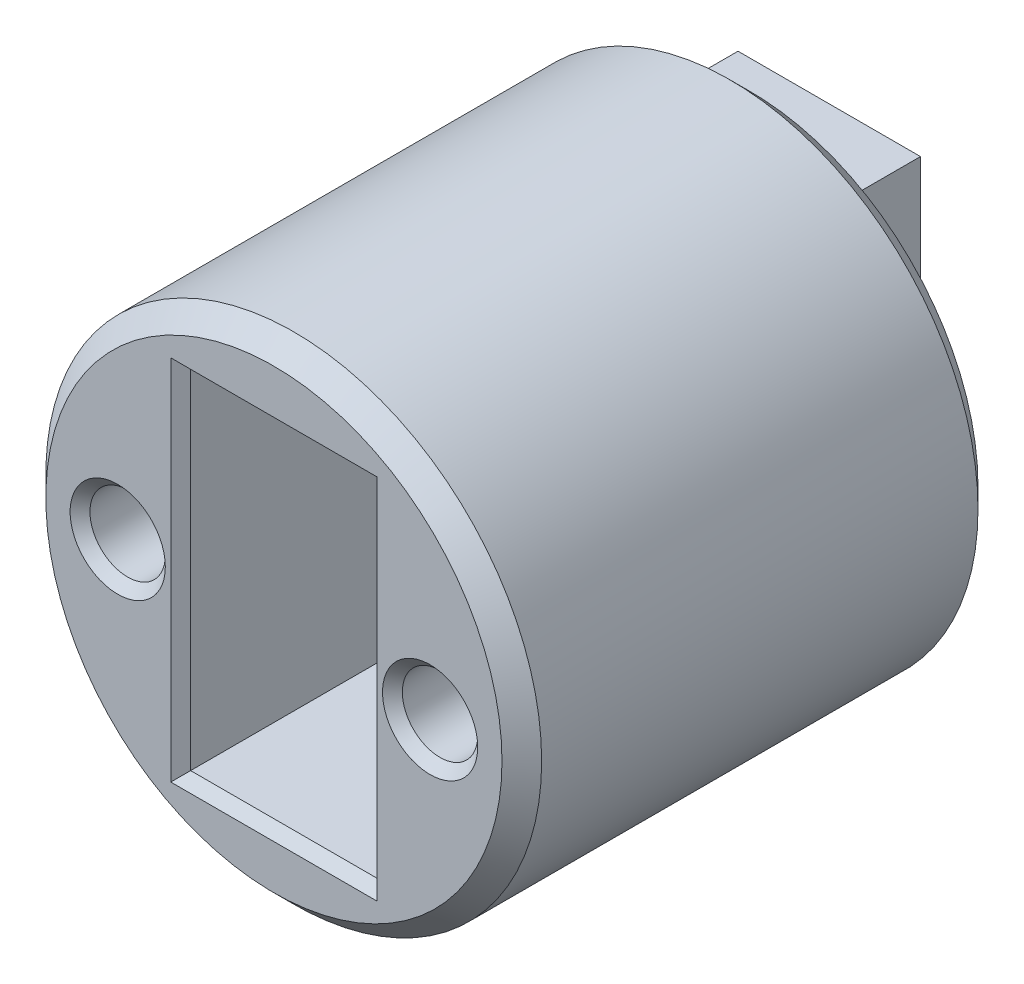
ISO-10303-21;
HEADER;
FILE_DESCRIPTION(('STEP AP214'),'2;1');
FILE_NAME('part.step','',(''),(''),'','','');
FILE_SCHEMA(('AUTOMOTIVE_DESIGN { 1 0 10303 214 1 1 1 1 }'));
ENDSEC;
DATA;
#1=APPLICATION_CONTEXT('core data for automotive mechanical design processes');
#2=APPLICATION_PROTOCOL_DEFINITION('international standard','automotive_design',2000,#1);
#3=PRODUCT_CONTEXT('',#1,'mechanical');
#4=PRODUCT('Part','Part','',(#3));
#5=PRODUCT_RELATED_PRODUCT_CATEGORY('part','',(#4));
#6=PRODUCT_DEFINITION_FORMATION('','',#4);
#7=PRODUCT_DEFINITION_CONTEXT('part definition',#1,'design');
#8=PRODUCT_DEFINITION('design','',#6,#7);
#9=PRODUCT_DEFINITION_SHAPE('','',#8);
#10=(LENGTH_UNIT() NAMED_UNIT(*) SI_UNIT(.MILLI.,.METRE.));
#11=(NAMED_UNIT(*) PLANE_ANGLE_UNIT() SI_UNIT($,.RADIAN.));
#12=(NAMED_UNIT(*) SI_UNIT($,.STERADIAN.) SOLID_ANGLE_UNIT());
#13=UNCERTAINTY_MEASURE_WITH_UNIT(LENGTH_MEASURE(1.E-05),#10,'distance_accuracy_value','');
#14=(GEOMETRIC_REPRESENTATION_CONTEXT(3) GLOBAL_UNCERTAINTY_ASSIGNED_CONTEXT((#13)) GLOBAL_UNIT_ASSIGNED_CONTEXT((#10,
#11,#12)) REPRESENTATION_CONTEXT('',''));
#15=CARTESIAN_POINT('',(0.,0.,0.));
#16=DIRECTION('',(0.,0.,1.));
#17=DIRECTION('',(1.,0.,0.));
#18=AXIS2_PLACEMENT_3D('',#15,#16,#17);
#19=CARTESIAN_POINT('',(0.,0.,6.));
#20=DIRECTION('',(0.,0.,1.));
#21=DIRECTION('',(1.,0.,0.));
#22=AXIS2_PLACEMENT_3D('',#19,#20,#21);
#23=PLANE('',#22);
#24=DIRECTION('',(-1.,0.,0.));
#25=VECTOR('',#24,1.);
#26=CARTESIAN_POINT('',(-3.,7.,6.));
#27=LINE('',#26,#25);
#28=CARTESIAN_POINT('',(3.,7.,6.));
#29=VERTEX_POINT('',#28);
#30=CARTESIAN_POINT('',(-3.,7.,6.));
#31=VERTEX_POINT('',#30);
#32=EDGE_CURVE('E213',#29,#31,#27,.T.);
#33=ORIENTED_EDGE('',*,*,#32,.F.);
#34=DIRECTION('',(0.,1.,0.));
#35=VECTOR('',#34,1.);
#36=CARTESIAN_POINT('',(3.,0.,6.));
#37=LINE('',#36,#35);
#38=CARTESIAN_POINT('',(3.,7.0625,6.));
#39=VERTEX_POINT('',#38);
#40=EDGE_CURVE('E349',#29,#39,#37,.T.);
#41=ORIENTED_EDGE('',*,*,#40,.T.);
#42=DIRECTION('',(-1.,0.,0.));
#43=VECTOR('',#42,1.);
#44=CARTESIAN_POINT('',(0.,7.0625,6.));
#45=LINE('',#44,#43);
#46=CARTESIAN_POINT('',(-3.,7.0625,6.));
#47=VERTEX_POINT('',#46);
#48=EDGE_CURVE('E346',#39,#47,#45,.T.);
#49=ORIENTED_EDGE('',*,*,#48,.T.);
#50=DIRECTION('',(0.,-1.,0.));
#51=VECTOR('',#50,1.);
#52=CARTESIAN_POINT('',(-3.,0.,6.));
#53=LINE('',#52,#51);
#54=EDGE_CURVE('E343',#47,#31,#53,.T.);
#55=ORIENTED_EDGE('',*,*,#54,.T.);
#56=EDGE_LOOP('',(#33,#41,#49,#55));
#57=FACE_BOUND('',#56,.T.);
#58=ADVANCED_FACE('F41',(#57),#23,.T.);
#59=CARTESIAN_POINT('',(0.,0.,0.));
#60=DIRECTION('',(0.,0.,1.));
#61=DIRECTION('',(1.,0.,0.));
#62=AXIS2_PLACEMENT_3D('',#59,#60,#61);
#63=PLANE('',#62);
#64=CARTESIAN_POINT('',(-7.875,0.,0.));
#65=DIRECTION('',(0.,0.,1.));
#66=DIRECTION('',(1.,0.,0.));
#67=AXIS2_PLACEMENT_3D('',#64,#65,#66);
#68=CIRCLE('',#67,1.9);
#69=CARTESIAN_POINT('',(-5.975,0.,0.));
#70=VERTEX_POINT('',#69);
#71=EDGE_CURVE('E232',#70,#70,#68,.T.);
#72=ORIENTED_EDGE('',*,*,#71,.T.);
#73=EDGE_LOOP('',(#72));
#74=FACE_BOUND('',#73,.T.);
#75=CARTESIAN_POINT('',(7.875,0.,0.));
#76=DIRECTION('',(0.,0.,1.));
#77=DIRECTION('',(1.,0.,0.));
#78=AXIS2_PLACEMENT_3D('',#75,#76,#77);
#79=CIRCLE('',#78,1.9);
#80=CARTESIAN_POINT('',(9.775,0.,0.));
#81=VERTEX_POINT('',#80);
#82=EDGE_CURVE('E222',#81,#81,#79,.T.);
#83=ORIENTED_EDGE('',*,*,#82,.T.);
#84=EDGE_LOOP('',(#83));
#85=FACE_BOUND('',#84,.T.);
#86=CARTESIAN_POINT('',(0.,0.,0.));
#87=DIRECTION('',(0.,0.,1.));
#88=DIRECTION('',(1.,0.,0.));
#89=AXIS2_PLACEMENT_3D('',#86,#87,#88);
#90=CIRCLE('',#89,11.5);
#91=CARTESIAN_POINT('',(11.5,0.,0.));
#92=VERTEX_POINT('',#91);
#93=EDGE_CURVE('E321',#92,#92,#90,.F.);
#94=ORIENTED_EDGE('',*,*,#93,.T.);
#95=EDGE_LOOP('',(#94));
#96=FACE_BOUND('',#95,.T.);
#97=DIRECTION('',(0.,1.,0.));
#98=VECTOR('',#97,1.);
#99=CARTESIAN_POINT('',(-4.6,8.95,0.));
#100=LINE('',#99,#98);
#101=CARTESIAN_POINT('',(-4.6,-8.95,0.));
#102=VERTEX_POINT('',#101);
#103=CARTESIAN_POINT('',(-4.6,8.95,0.));
#104=VERTEX_POINT('',#103);
#105=EDGE_CURVE('E237',#102,#104,#100,.T.);
#106=ORIENTED_EDGE('',*,*,#105,.F.);
#107=DIRECTION('',(-1.,0.,0.));
#108=VECTOR('',#107,1.);
#109=CARTESIAN_POINT('',(4.6,-8.95,0.));
#110=LINE('',#109,#108);
#111=CARTESIAN_POINT('',(4.6,-8.95,0.));
#112=VERTEX_POINT('',#111);
#113=EDGE_CURVE('E250',#112,#102,#110,.T.);
#114=ORIENTED_EDGE('',*,*,#113,.F.);
#115=DIRECTION('',(0.,-1.,0.));
#116=VECTOR('',#115,1.);
#117=CARTESIAN_POINT('',(4.6,8.95,0.));
#118=LINE('',#117,#116);
#119=CARTESIAN_POINT('',(4.6,8.95,0.));
#120=VERTEX_POINT('',#119);
#121=EDGE_CURVE('E246',#120,#112,#118,.T.);
#122=ORIENTED_EDGE('',*,*,#121,.F.);
#123=DIRECTION('',(1.,0.,0.));
#124=VECTOR('',#123,1.);
#125=CARTESIAN_POINT('',(4.6,8.95,0.));
#126=LINE('',#125,#124);
#127=EDGE_CURVE('E241',#104,#120,#126,.T.);
#128=ORIENTED_EDGE('',*,*,#127,.F.);
#129=EDGE_LOOP('',(#106,#114,#122,#128));
#130=FACE_BOUND('',#129,.T.);
#131=ADVANCED_FACE('F496',(#74,#85,#96,#130),#63,.F.);
#132=CARTESIAN_POINT('',(0.,0.,24.));
#133=DIRECTION('',(0.,0.,-1.));
#134=DIRECTION('',(-1.,0.,0.));
#135=AXIS2_PLACEMENT_3D('',#132,#133,#134);
#136=CYLINDRICAL_SURFACE('',#135,12.5);
#137=CARTESIAN_POINT('',(0.,0.,23.));
#138=DIRECTION('',(0.,0.,1.));
#139=DIRECTION('',(1.,0.,0.));
#140=AXIS2_PLACEMENT_3D('',#137,#138,#139);
#141=CIRCLE('',#140,12.5);
#142=CARTESIAN_POINT('',(12.5,0.,23.));
#143=VERTEX_POINT('',#142);
#144=EDGE_CURVE('E329',#143,#143,#141,.F.);
#145=ORIENTED_EDGE('',*,*,#144,.T.);
#146=EDGE_LOOP('',(#145));
#147=FACE_BOUND('',#146,.T.);
#148=CARTESIAN_POINT('',(0.,0.,1.));
#149=DIRECTION('',(0.,0.,1.));
#150=DIRECTION('',(1.,0.,0.));
#151=AXIS2_PLACEMENT_3D('',#148,#149,#150);
#152=CIRCLE('',#151,12.5);
#153=CARTESIAN_POINT('',(12.5,0.,1.));
#154=VERTEX_POINT('',#153);
#155=EDGE_CURVE('E305',#154,#154,#152,.T.);
#156=ORIENTED_EDGE('',*,*,#155,.T.);
#157=EDGE_LOOP('',(#156));
#158=FACE_BOUND('',#157,.T.);
#159=ADVANCED_FACE('F500',(#147,#158),#136,.T.);
#160=CARTESIAN_POINT('',(0.,0.,24.));
#161=DIRECTION('',(0.,0.,1.));
#162=DIRECTION('',(1.,0.,0.));
#163=AXIS2_PLACEMENT_3D('',#160,#161,#162);
#164=PLANE('',#163);
#165=DIRECTION('',(0.,-1.,0.));
#166=VECTOR('',#165,1.);
#167=CARTESIAN_POINT('',(5.2,-8.7625,24.));
#168=LINE('',#167,#166);
#169=CARTESIAN_POINT('',(5.2,9.2625,24.));
#170=VERTEX_POINT('',#169);
#171=CARTESIAN_POINT('',(5.2,-9.2625,24.));
#172=VERTEX_POINT('',#171);
#173=EDGE_CURVE('E405',#170,#172,#168,.T.);
#174=ORIENTED_EDGE('',*,*,#173,.T.);
#175=DIRECTION('',(-1.,0.,0.));
#176=VECTOR('',#175,1.);
#177=CARTESIAN_POINT('',(-4.7,-9.2625,24.));
#178=LINE('',#177,#176);
#179=CARTESIAN_POINT('',(-5.2,-9.2625,24.));
#180=VERTEX_POINT('',#179);
#181=EDGE_CURVE('E408',#172,#180,#178,.T.);
#182=ORIENTED_EDGE('',*,*,#181,.T.);
#183=DIRECTION('',(0.,1.,0.));
#184=VECTOR('',#183,1.);
#185=CARTESIAN_POINT('',(-5.2,8.7625,24.));
#186=LINE('',#185,#184);
#187=CARTESIAN_POINT('',(-5.2,9.2625,24.));
#188=VERTEX_POINT('',#187);
#189=EDGE_CURVE('E402',#180,#188,#186,.T.);
#190=ORIENTED_EDGE('',*,*,#189,.T.);
#191=DIRECTION('',(1.,0.,0.));
#192=VECTOR('',#191,1.);
#193=CARTESIAN_POINT('',(4.7,9.2625,24.));
#194=LINE('',#193,#192);
#195=EDGE_CURVE('E399',#188,#170,#194,.T.);
#196=ORIENTED_EDGE('',*,*,#195,.T.);
#197=EDGE_LOOP('',(#174,#182,#190,#196));
#198=FACE_BOUND('',#197,.T.);
#199=CARTESIAN_POINT('',(-7.875,0.,24.));
#200=DIRECTION('',(0.,0.,1.));
#201=DIRECTION('',(1.,0.,0.));
#202=AXIS2_PLACEMENT_3D('',#199,#200,#201);
#203=CIRCLE('',#202,2.40000000000004);
#204=CARTESIAN_POINT('',(-5.47499999999996,0.,24.));
#205=VERTEX_POINT('',#204);
#206=EDGE_CURVE('E387',#205,#205,#203,.F.);
#207=ORIENTED_EDGE('',*,*,#206,.T.);
#208=EDGE_LOOP('',(#207));
#209=FACE_BOUND('',#208,.T.);
#210=CARTESIAN_POINT('',(7.875,0.,24.));
#211=DIRECTION('',(0.,0.,1.));
#212=DIRECTION('',(1.,0.,0.));
#213=AXIS2_PLACEMENT_3D('',#210,#211,#212);
#214=CIRCLE('',#213,2.40000000000003);
#215=CARTESIAN_POINT('',(10.275,0.,24.));
#216=VERTEX_POINT('',#215);
#217=EDGE_CURVE('E383',#216,#216,#214,.F.);
#218=ORIENTED_EDGE('',*,*,#217,.T.);
#219=EDGE_LOOP('',(#218));
#220=FACE_BOUND('',#219,.T.);
#221=CARTESIAN_POINT('',(0.,0.,24.));
#222=DIRECTION('',(0.,0.,1.));
#223=DIRECTION('',(1.,0.,0.));
#224=AXIS2_PLACEMENT_3D('',#221,#222,#223);
#225=CIRCLE('',#224,11.5);
#226=CARTESIAN_POINT('',(11.5,0.,24.));
#227=VERTEX_POINT('',#226);
#228=EDGE_CURVE('E325',#227,#227,#225,.T.);
#229=ORIENTED_EDGE('',*,*,#228,.T.);
#230=EDGE_LOOP('',(#229));
#231=FACE_BOUND('',#230,.T.);
#232=ADVANCED_FACE('F438',(#198,#209,#220,#231),#164,.T.);
#233=CARTESIAN_POINT('',(4.7,8.7625,6.));
#234=DIRECTION('',(1.,0.,0.));
#235=DIRECTION('',(0.,1.,0.));
#236=AXIS2_PLACEMENT_3D('',#233,#234,#235);
#237=PLANE('',#236);
#238=DIRECTION('',(0.,0.,1.));
#239=VECTOR('',#238,1.);
#240=CARTESIAN_POINT('',(4.7,-8.7625,6.));
#241=LINE('',#240,#239);
#242=CARTESIAN_POINT('',(4.7,-8.7625,7.69999999999998));
#243=VERTEX_POINT('',#242);
#244=CARTESIAN_POINT('',(4.7,-8.7625,23.5));
#245=VERTEX_POINT('',#244);
#246=EDGE_CURVE('E267',#243,#245,#241,.T.);
#247=ORIENTED_EDGE('',*,*,#246,.T.);
#248=DIRECTION('',(0.,1.,0.));
#249=VECTOR('',#248,1.);
#250=CARTESIAN_POINT('',(4.7,8.7625,23.5));
#251=LINE('',#250,#249);
#252=CARTESIAN_POINT('',(4.7,8.7625,23.5));
#253=VERTEX_POINT('',#252);
#254=EDGE_CURVE('E66',#245,#253,#251,.T.);
#255=ORIENTED_EDGE('',*,*,#254,.T.);
#256=DIRECTION('',(0.,0.,1.));
#257=VECTOR('',#256,1.);
#258=CARTESIAN_POINT('',(4.7,8.7625,6.));
#259=LINE('',#258,#257);
#260=CARTESIAN_POINT('',(4.7,8.7625,7.69999999999998));
#261=VERTEX_POINT('',#260);
#262=EDGE_CURVE('E266',#261,#253,#259,.T.);
#263=ORIENTED_EDGE('',*,*,#262,.F.);
#264=DIRECTION('',(0.,-1.,0.));
#265=VECTOR('',#264,1.);
#266=CARTESIAN_POINT('',(4.7,8.7625,7.69999999999998));
#267=LINE('',#266,#265);
#268=EDGE_CURVE('E352',#261,#243,#267,.T.);
#269=ORIENTED_EDGE('',*,*,#268,.T.);
#270=EDGE_LOOP('',(#247,#255,#263,#269));
#271=FACE_BOUND('',#270,.T.);
#272=ADVANCED_FACE('F450',(#271),#237,.F.);
#273=CARTESIAN_POINT('',(-4.7,-8.7625,6.));
#274=DIRECTION('',(0.,-1.,0.));
#275=DIRECTION('',(0.,0.,-1.));
#276=AXIS2_PLACEMENT_3D('',#273,#274,#275);
#277=PLANE('',#276);
#278=DIRECTION('',(0.,0.,1.));
#279=VECTOR('',#278,1.);
#280=CARTESIAN_POINT('',(-4.7,-8.7625,6.));
#281=LINE('',#280,#279);
#282=CARTESIAN_POINT('',(-4.7,-8.7625,7.69999999999998));
#283=VERTEX_POINT('',#282);
#284=CARTESIAN_POINT('',(-4.7,-8.7625,23.5));
#285=VERTEX_POINT('',#284);
#286=EDGE_CURVE('E271',#283,#285,#281,.T.);
#287=ORIENTED_EDGE('',*,*,#286,.T.);
#288=DIRECTION('',(1.,0.,0.));
#289=VECTOR('',#288,1.);
#290=CARTESIAN_POINT('',(4.7,-8.7625,23.5));
#291=LINE('',#290,#289);
#292=EDGE_CURVE('E395',#285,#245,#291,.T.);
#293=ORIENTED_EDGE('',*,*,#292,.T.);
#294=ORIENTED_EDGE('',*,*,#246,.F.);
#295=DIRECTION('',(-1.,0.,0.));
#296=VECTOR('',#295,1.);
#297=CARTESIAN_POINT('',(-4.7,-8.7625,7.69999999999998));
#298=LINE('',#297,#296);
#299=EDGE_CURVE('E359',#243,#283,#298,.T.);
#300=ORIENTED_EDGE('',*,*,#299,.T.);
#301=EDGE_LOOP('',(#287,#293,#294,#300));
#302=FACE_BOUND('',#301,.T.);
#303=ADVANCED_FACE('F448',(#302),#277,.F.);
#304=CARTESIAN_POINT('',(-4.7,8.7625,6.));
#305=DIRECTION('',(-1.,0.,0.));
#306=DIRECTION('',(0.,-1.,0.));
#307=AXIS2_PLACEMENT_3D('',#304,#305,#306);
#308=PLANE('',#307);
#309=DIRECTION('',(0.,0.,1.));
#310=VECTOR('',#309,1.);
#311=CARTESIAN_POINT('',(-4.7,8.7625,6.));
#312=LINE('',#311,#310);
#313=CARTESIAN_POINT('',(-4.7,8.7625,7.69999999999998));
#314=VERTEX_POINT('',#313);
#315=CARTESIAN_POINT('',(-4.7,8.7625,23.5));
#316=VERTEX_POINT('',#315);
#317=EDGE_CURVE('E275',#314,#316,#312,.T.);
#318=ORIENTED_EDGE('',*,*,#317,.T.);
#319=DIRECTION('',(0.,-1.,0.));
#320=VECTOR('',#319,1.);
#321=CARTESIAN_POINT('',(-4.7,-8.7625,23.5));
#322=LINE('',#321,#320);
#323=EDGE_CURVE('E52',#316,#285,#322,.T.);
#324=ORIENTED_EDGE('',*,*,#323,.T.);
#325=ORIENTED_EDGE('',*,*,#286,.F.);
#326=DIRECTION('',(0.,1.,0.));
#327=VECTOR('',#326,1.);
#328=CARTESIAN_POINT('',(-4.7,8.7625,7.69999999999998));
#329=LINE('',#328,#327);
#330=EDGE_CURVE('E362',#283,#314,#329,.T.);
#331=ORIENTED_EDGE('',*,*,#330,.T.);
#332=EDGE_LOOP('',(#318,#324,#325,#331));
#333=FACE_BOUND('',#332,.T.);
#334=ADVANCED_FACE('F483',(#333),#308,.F.);
#335=CARTESIAN_POINT('',(-4.7,8.7625,6.));
#336=DIRECTION('',(0.,1.,0.));
#337=DIRECTION('',(0.,0.,1.));
#338=AXIS2_PLACEMENT_3D('',#335,#336,#337);
#339=PLANE('',#338);
#340=ORIENTED_EDGE('',*,*,#262,.T.);
#341=DIRECTION('',(-1.,0.,0.));
#342=VECTOR('',#341,1.);
#343=CARTESIAN_POINT('',(-4.7,8.7625,23.5));
#344=LINE('',#343,#342);
#345=EDGE_CURVE('E11',#253,#316,#344,.T.);
#346=ORIENTED_EDGE('',*,*,#345,.T.);
#347=ORIENTED_EDGE('',*,*,#317,.F.);
#348=DIRECTION('',(1.,0.,0.));
#349=VECTOR('',#348,1.);
#350=CARTESIAN_POINT('',(-4.7,8.7625,7.69999999999998));
#351=LINE('',#350,#349);
#352=EDGE_CURVE('E356',#314,#261,#351,.T.);
#353=ORIENTED_EDGE('',*,*,#352,.T.);
#354=EDGE_LOOP('',(#340,#346,#347,#353));
#355=FACE_BOUND('',#354,.T.);
#356=ADVANCED_FACE('F484',(#355),#339,.F.);
#357=DIRECTION('',(1.,0.,0.));
#358=VECTOR('',#357,1.);
#359=CARTESIAN_POINT('',(0.,-7.0625,6.));
#360=LINE('',#359,#358);
#361=CARTESIAN_POINT('',(-3.,-7.0625,6.));
#362=VERTEX_POINT('',#361);
#363=CARTESIAN_POINT('',(3.,-7.0625,6.));
#364=VERTEX_POINT('',#363);
#365=EDGE_CURVE('E336',#362,#364,#360,.T.);
#366=ORIENTED_EDGE('',*,*,#365,.T.);
#367=DIRECTION('',(0.,1.,0.));
#368=VECTOR('',#367,1.);
#369=CARTESIAN_POINT('',(3.,0.,6.));
#370=LINE('',#369,#368);
#371=CARTESIAN_POINT('',(3.,-7.,6.));
#372=VERTEX_POINT('',#371);
#373=EDGE_CURVE('E339',#364,#372,#370,.T.);
#374=ORIENTED_EDGE('',*,*,#373,.T.);
#375=DIRECTION('',(1.,0.,0.));
#376=VECTOR('',#375,1.);
#377=CARTESIAN_POINT('',(-3.,-7.,6.));
#378=LINE('',#377,#376);
#379=CARTESIAN_POINT('',(-3.,-7.,6.));
#380=VERTEX_POINT('',#379);
#381=EDGE_CURVE('E200',#380,#372,#378,.T.);
#382=ORIENTED_EDGE('',*,*,#381,.F.);
#383=DIRECTION('',(0.,-1.,0.));
#384=VECTOR('',#383,1.);
#385=CARTESIAN_POINT('',(-3.,0.,6.));
#386=LINE('',#385,#384);
#387=EDGE_CURVE('E333',#380,#362,#386,.T.);
#388=ORIENTED_EDGE('',*,*,#387,.T.);
#389=EDGE_LOOP('',(#366,#374,#382,#388));
#390=FACE_BOUND('',#389,.T.);
#391=ADVANCED_FACE('F478',(#390),#23,.T.);
#392=CARTESIAN_POINT('',(-4.6,8.95,-5.));
#393=DIRECTION('',(1.,0.,0.));
#394=DIRECTION('',(0.,1.,0.));
#395=AXIS2_PLACEMENT_3D('',#392,#393,#394);
#396=PLANE('',#395);
#397=DIRECTION('',(0.,0.,1.));
#398=VECTOR('',#397,1.);
#399=CARTESIAN_POINT('',(-4.6,8.95,-5.));
#400=LINE('',#399,#398);
#401=CARTESIAN_POINT('',(-4.6,8.95,-4.));
#402=VERTEX_POINT('',#401);
#403=EDGE_CURVE('E263',#402,#104,#400,.T.);
#404=ORIENTED_EDGE('',*,*,#403,.F.);
#405=DIRECTION('',(0.,-1.,0.));
#406=VECTOR('',#405,1.);
#407=CARTESIAN_POINT('',(-4.6,-8.95,-4.));
#408=LINE('',#407,#406);
#409=CARTESIAN_POINT('',(-4.6,-8.95,-4.));
#410=VERTEX_POINT('',#409);
#411=EDGE_CURVE('E292',#402,#410,#408,.T.);
#412=ORIENTED_EDGE('',*,*,#411,.T.);
#413=DIRECTION('',(0.,0.,1.));
#414=VECTOR('',#413,1.);
#415=CARTESIAN_POINT('',(-4.6,-8.95,-5.));
#416=LINE('',#415,#414);
#417=EDGE_CURVE('E254',#410,#102,#416,.T.);
#418=ORIENTED_EDGE('',*,*,#417,.T.);
#419=ORIENTED_EDGE('',*,*,#105,.T.);
#420=EDGE_LOOP('',(#404,#412,#418,#419));
#421=FACE_BOUND('',#420,.T.);
#422=ADVANCED_FACE('F491',(#421),#396,.F.);
#423=CARTESIAN_POINT('',(4.6,8.95,-5.));
#424=DIRECTION('',(0.,-1.,0.));
#425=DIRECTION('',(0.,0.,-1.));
#426=AXIS2_PLACEMENT_3D('',#423,#424,#425);
#427=PLANE('',#426);
#428=DIRECTION('',(0.,0.,1.));
#429=VECTOR('',#428,1.);
#430=CARTESIAN_POINT('',(4.6,8.95,-5.));
#431=LINE('',#430,#429);
#432=CARTESIAN_POINT('',(4.6,8.95,-4.));
#433=VERTEX_POINT('',#432);
#434=EDGE_CURVE('E260',#433,#120,#431,.T.);
#435=ORIENTED_EDGE('',*,*,#434,.F.);
#436=DIRECTION('',(-1.,0.,0.));
#437=VECTOR('',#436,1.);
#438=CARTESIAN_POINT('',(-4.6,8.95,-4.));
#439=LINE('',#438,#437);
#440=EDGE_CURVE('E299',#433,#402,#439,.T.);
#441=ORIENTED_EDGE('',*,*,#440,.T.);
#442=ORIENTED_EDGE('',*,*,#403,.T.);
#443=ORIENTED_EDGE('',*,*,#127,.T.);
#444=EDGE_LOOP('',(#435,#441,#442,#443));
#445=FACE_BOUND('',#444,.T.);
#446=ADVANCED_FACE('F725',(#445),#427,.F.);
#447=CARTESIAN_POINT('',(4.6,8.95,-5.));
#448=DIRECTION('',(-1.,0.,0.));
#449=DIRECTION('',(0.,-1.,0.));
#450=AXIS2_PLACEMENT_3D('',#447,#448,#449);
#451=PLANE('',#450);
#452=DIRECTION('',(0.,0.,1.));
#453=VECTOR('',#452,1.);
#454=CARTESIAN_POINT('',(4.6,-8.95,-5.));
#455=LINE('',#454,#453);
#456=CARTESIAN_POINT('',(4.6,-8.95,-4.));
#457=VERTEX_POINT('',#456);
#458=EDGE_CURVE('E257',#457,#112,#455,.T.);
#459=ORIENTED_EDGE('',*,*,#458,.F.);
#460=DIRECTION('',(0.,1.,0.));
#461=VECTOR('',#460,1.);
#462=CARTESIAN_POINT('',(4.6,8.95,-4.));
#463=LINE('',#462,#461);
#464=EDGE_CURVE('E302',#457,#433,#463,.T.);
#465=ORIENTED_EDGE('',*,*,#464,.T.);
#466=ORIENTED_EDGE('',*,*,#434,.T.);
#467=ORIENTED_EDGE('',*,*,#121,.T.);
#468=EDGE_LOOP('',(#459,#465,#466,#467));
#469=FACE_BOUND('',#468,.T.);
#470=ADVANCED_FACE('F717',(#469),#451,.F.);
#471=CARTESIAN_POINT('',(4.6,-8.95,-5.));
#472=DIRECTION('',(0.,1.,0.));
#473=DIRECTION('',(0.,0.,1.));
#474=AXIS2_PLACEMENT_3D('',#471,#472,#473);
#475=PLANE('',#474);
#476=ORIENTED_EDGE('',*,*,#417,.F.);
#477=DIRECTION('',(1.,0.,0.));
#478=VECTOR('',#477,1.);
#479=CARTESIAN_POINT('',(4.6,-8.95,-4.));
#480=LINE('',#479,#478);
#481=EDGE_CURVE('E296',#410,#457,#480,.T.);
#482=ORIENTED_EDGE('',*,*,#481,.T.);
#483=ORIENTED_EDGE('',*,*,#458,.T.);
#484=ORIENTED_EDGE('',*,*,#113,.T.);
#485=EDGE_LOOP('',(#476,#482,#483,#484));
#486=FACE_BOUND('',#485,.T.);
#487=ADVANCED_FACE('F711',(#486),#475,.F.);
#488=CARTESIAN_POINT('',(0.,0.,-5.));
#489=DIRECTION('',(0.,0.,-1.));
#490=DIRECTION('',(-1.,0.,0.));
#491=AXIS2_PLACEMENT_3D('',#488,#489,#490);
#492=PLANE('',#491);
#493=DIRECTION('',(0.,1.,0.));
#494=VECTOR('',#493,1.);
#495=CARTESIAN_POINT('',(3.,7.,-5.));
#496=LINE('',#495,#494);
#497=CARTESIAN_POINT('',(3.,-7.,-5.));
#498=VERTEX_POINT('',#497);
#499=CARTESIAN_POINT('',(3.,7.,-5.));
#500=VERTEX_POINT('',#499);
#501=EDGE_CURVE('E176',#498,#500,#496,.T.);
#502=ORIENTED_EDGE('',*,*,#501,.T.);
#503=DIRECTION('',(-1.,0.,0.));
#504=VECTOR('',#503,1.);
#505=CARTESIAN_POINT('',(-3.,7.,-5.));
#506=LINE('',#505,#504);
#507=CARTESIAN_POINT('',(-3.,7.,-5.));
#508=VERTEX_POINT('',#507);
#509=EDGE_CURVE('E188',#500,#508,#506,.T.);
#510=ORIENTED_EDGE('',*,*,#509,.T.);
#511=DIRECTION('',(0.,-1.,0.));
#512=VECTOR('',#511,1.);
#513=CARTESIAN_POINT('',(-3.,7.,-5.));
#514=LINE('',#513,#512);
#515=CARTESIAN_POINT('',(-3.,-7.,-5.));
#516=VERTEX_POINT('',#515);
#517=EDGE_CURVE('E194',#508,#516,#514,.T.);
#518=ORIENTED_EDGE('',*,*,#517,.T.);
#519=DIRECTION('',(1.,0.,0.));
#520=VECTOR('',#519,1.);
#521=CARTESIAN_POINT('',(-3.,-7.,-5.));
#522=LINE('',#521,#520);
#523=EDGE_CURVE('E184',#516,#498,#522,.T.);
#524=ORIENTED_EDGE('',*,*,#523,.T.);
#525=EDGE_LOOP('',(#502,#510,#518,#524));
#526=FACE_BOUND('',#525,.T.);
#527=DIRECTION('',(-1.,0.,0.));
#528=VECTOR('',#527,1.);
#529=CARTESIAN_POINT('',(-4.6,-7.95000000000001,-5.));
#530=LINE('',#529,#528);
#531=CARTESIAN_POINT('',(3.6,-7.95000000000001,-5.));
#532=VERTEX_POINT('',#531);
#533=CARTESIAN_POINT('',(-3.60000000000001,-7.95000000000001,-5.));
#534=VERTEX_POINT('',#533);
#535=EDGE_CURVE('E285',#532,#534,#530,.T.);
#536=ORIENTED_EDGE('',*,*,#535,.T.);
#537=DIRECTION('',(0.,1.,0.));
#538=VECTOR('',#537,1.);
#539=CARTESIAN_POINT('',(-3.6,8.95,-5.));
#540=LINE('',#539,#538);
#541=CARTESIAN_POINT('',(-3.6,7.95,-5.));
#542=VERTEX_POINT('',#541);
#543=EDGE_CURVE('E288',#534,#542,#540,.T.);
#544=ORIENTED_EDGE('',*,*,#543,.T.);
#545=DIRECTION('',(1.,0.,0.));
#546=VECTOR('',#545,1.);
#547=CARTESIAN_POINT('',(4.6,7.95,-5.));
#548=LINE('',#547,#546);
#549=CARTESIAN_POINT('',(3.60000000000001,7.95,-5.));
#550=VERTEX_POINT('',#549);
#551=EDGE_CURVE('E282',#542,#550,#548,.T.);
#552=ORIENTED_EDGE('',*,*,#551,.T.);
#553=DIRECTION('',(0.,-1.,0.));
#554=VECTOR('',#553,1.);
#555=CARTESIAN_POINT('',(3.6,-8.95,-5.));
#556=LINE('',#555,#554);
#557=EDGE_CURVE('E270',#550,#532,#556,.T.);
#558=ORIENTED_EDGE('',*,*,#557,.T.);
#559=EDGE_LOOP('',(#536,#544,#552,#558));
#560=FACE_BOUND('',#559,.T.);
#561=ADVANCED_FACE('F196',(#526,#560),#492,.T.);
#562=CARTESIAN_POINT('',(3.60000000000001,0.,-5.));
#563=DIRECTION('',(0.70710678118655,0.,-0.707106781186545));
#564=DIRECTION('',(0.,1.,0.));
#565=AXIS2_PLACEMENT_3D('',#562,#563,#564);
#566=PLANE('',#565);
#567=DIRECTION('',(0.577350269189625,0.577350269189624,0.577350269189628));
#568=VECTOR('',#567,1.);
#569=CARTESIAN_POINT('',(0.950000000000017,5.30000000000001,-7.65000000000001));
#570=LINE('',#569,#568);
#571=EDGE_CURVE('E311',#433,#550,#570,.F.);
#572=ORIENTED_EDGE('',*,*,#571,.F.);
#573=ORIENTED_EDGE('',*,*,#464,.F.);
#574=DIRECTION('',(-0.577350269189624,0.577350269189624,-0.577350269189628));
#575=VECTOR('',#574,1.);
#576=CARTESIAN_POINT('',(0.950000000000014,-5.30000000000002,-7.65000000000001));
#577=LINE('',#576,#575);
#578=EDGE_CURVE('E242',#532,#457,#577,.F.);
#579=ORIENTED_EDGE('',*,*,#578,.F.);
#580=ORIENTED_EDGE('',*,*,#557,.F.);
#581=EDGE_LOOP('',(#572,#573,#579,#580));
#582=FACE_BOUND('',#581,.T.);
#583=ADVANCED_FACE('F541',(#582),#566,.T.);
#584=CARTESIAN_POINT('',(0.,-7.95000000000001,-5.));
#585=DIRECTION('',(0.,-0.70710678118655,-0.707106781186545));
#586=DIRECTION('',(1.,0.,0.));
#587=AXIS2_PLACEMENT_3D('',#584,#585,#586);
#588=PLANE('',#587);
#589=ORIENTED_EDGE('',*,*,#578,.T.);
#590=ORIENTED_EDGE('',*,*,#481,.F.);
#591=DIRECTION('',(0.577350269189625,0.577350269189624,-0.577350269189628));
#592=VECTOR('',#591,1.);
#593=CARTESIAN_POINT('',(-2.40000000000001,-6.75000000000001,-6.20000000000001));
#594=LINE('',#593,#592);
#595=EDGE_CURVE('E308',#534,#410,#594,.F.);
#596=ORIENTED_EDGE('',*,*,#595,.F.);
#597=ORIENTED_EDGE('',*,*,#535,.F.);
#598=EDGE_LOOP('',(#589,#590,#596,#597));
#599=FACE_BOUND('',#598,.T.);
#600=ADVANCED_FACE('F534',(#599),#588,.T.);
#601=CARTESIAN_POINT('',(0.,7.95,-5.));
#602=DIRECTION('',(0.,0.70710678118655,-0.707106781186545));
#603=DIRECTION('',(-1.,0.,0.));
#604=AXIS2_PLACEMENT_3D('',#601,#602,#603);
#605=PLANE('',#604);
#606=ORIENTED_EDGE('',*,*,#571,.T.);
#607=ORIENTED_EDGE('',*,*,#551,.F.);
#608=DIRECTION('',(-0.577350269189624,0.577350269189624,0.577350269189628));
#609=VECTOR('',#608,1.);
#610=CARTESIAN_POINT('',(-2.40000000000001,6.75000000000001,-6.2));
#611=LINE('',#610,#609);
#612=EDGE_CURVE('E236',#402,#542,#611,.F.);
#613=ORIENTED_EDGE('',*,*,#612,.F.);
#614=ORIENTED_EDGE('',*,*,#440,.F.);
#615=EDGE_LOOP('',(#606,#607,#613,#614));
#616=FACE_BOUND('',#615,.T.);
#617=ADVANCED_FACE('F527',(#616),#605,.T.);
#618=CARTESIAN_POINT('',(-3.60000000000001,0.,-5.));
#619=DIRECTION('',(-0.70710678118655,0.,-0.707106781186545));
#620=DIRECTION('',(0.,-1.,0.));
#621=AXIS2_PLACEMENT_3D('',#618,#619,#620);
#622=PLANE('',#621);
#623=ORIENTED_EDGE('',*,*,#595,.T.);
#624=ORIENTED_EDGE('',*,*,#411,.F.);
#625=ORIENTED_EDGE('',*,*,#612,.T.);
#626=ORIENTED_EDGE('',*,*,#543,.F.);
#627=EDGE_LOOP('',(#623,#624,#625,#626));
#628=FACE_BOUND('',#627,.T.);
#629=ADVANCED_FACE('F519',(#628),#622,.T.);
#630=CARTESIAN_POINT('',(0.,0.,1.));
#631=DIRECTION('',(0.,0.,1.));
#632=DIRECTION('',(1.,0.,0.));
#633=AXIS2_PLACEMENT_3D('',#630,#631,#632);
#634=CONICAL_SURFACE('',#633,12.5,0.78539816339745);
#635=ORIENTED_EDGE('',*,*,#93,.F.);
#636=EDGE_LOOP('',(#635));
#637=FACE_BOUND('',#636,.T.);
#638=ORIENTED_EDGE('',*,*,#155,.F.);
#639=EDGE_LOOP('',(#638));
#640=FACE_BOUND('',#639,.T.);
#641=ADVANCED_FACE('F526',(#637,#640),#634,.T.);
#642=CARTESIAN_POINT('',(7.875,0.,-5.));
#643=DIRECTION('',(0.,0.,1.));
#644=DIRECTION('',(1.,0.,0.));
#645=AXIS2_PLACEMENT_3D('',#642,#643,#644);
#646=CYLINDRICAL_SURFACE('',#645,1.9);
#647=CARTESIAN_POINT('',(7.875,0.,23.5));
#648=DIRECTION('',(0.,0.,1.));
#649=DIRECTION('',(1.,0.,0.));
#650=AXIS2_PLACEMENT_3D('',#647,#648,#649);
#651=CIRCLE('',#650,1.9);
#652=CARTESIAN_POINT('',(9.775,0.,23.5));
#653=VERTEX_POINT('',#652);
#654=EDGE_CURVE('E391',#653,#653,#651,.T.);
#655=CARTESIAN_POINT('',(9.775,0.,23.5));
#656=CARTESIAN_POINT('',(9.775,0.,23.2552083333333));
#657=CARTESIAN_POINT('',(9.775,0.,23.0104166666667));
#658=CARTESIAN_POINT('',(9.775,0.,22.5208333333333));
#659=CARTESIAN_POINT('',(9.775,0.,22.2760416666667));
#660=CARTESIAN_POINT('',(9.775,0.,21.7864583333333));
#661=CARTESIAN_POINT('',(9.775,0.,21.5416666666667));
#662=CARTESIAN_POINT('',(9.775,0.,21.0520833333333));
#663=CARTESIAN_POINT('',(9.775,0.,20.8072916666667));
#664=CARTESIAN_POINT('',(9.775,0.,20.3177083333333));
#665=CARTESIAN_POINT('',(9.775,0.,20.0729166666667));
#666=CARTESIAN_POINT('',(9.775,0.,19.5833333333333));
#667=CARTESIAN_POINT('',(9.775,0.,19.3385416666667));
#668=CARTESIAN_POINT('',(9.775,0.,18.8489583333333));
#669=CARTESIAN_POINT('',(9.775,0.,18.6041666666667));
#670=CARTESIAN_POINT('',(9.775,0.,18.1145833333333));
#671=CARTESIAN_POINT('',(9.775,0.,17.8697916666667));
#672=CARTESIAN_POINT('',(9.775,0.,17.3802083333333));
#673=CARTESIAN_POINT('',(9.775,0.,17.1354166666667));
#674=CARTESIAN_POINT('',(9.775,0.,16.6458333333333));
#675=CARTESIAN_POINT('',(9.775,0.,16.4010416666667));
#676=CARTESIAN_POINT('',(9.775,0.,15.9114583333333));
#677=CARTESIAN_POINT('',(9.775,0.,15.6666666666667));
#678=CARTESIAN_POINT('',(9.775,0.,15.1770833333333));
#679=CARTESIAN_POINT('',(9.775,0.,14.9322916666667));
#680=CARTESIAN_POINT('',(9.775,0.,14.4427083333333));
#681=CARTESIAN_POINT('',(9.775,0.,14.1979166666667));
#682=CARTESIAN_POINT('',(9.775,0.,13.7083333333333));
#683=CARTESIAN_POINT('',(9.775,0.,13.4635416666667));
#684=CARTESIAN_POINT('',(9.775,0.,12.9739583333333));
#685=CARTESIAN_POINT('',(9.775,0.,12.7291666666667));
#686=CARTESIAN_POINT('',(9.775,0.,12.2395833333333));
#687=CARTESIAN_POINT('',(9.775,0.,11.9947916666667));
#688=CARTESIAN_POINT('',(9.775,0.,11.5052083333333));
#689=CARTESIAN_POINT('',(9.775,0.,11.2604166666667));
#690=CARTESIAN_POINT('',(9.775,0.,10.7708333333333));
#691=CARTESIAN_POINT('',(9.775,0.,10.5260416666667));
#692=CARTESIAN_POINT('',(9.775,0.,10.0364583333333));
#693=CARTESIAN_POINT('',(9.775,0.,9.79166666666666));
#694=CARTESIAN_POINT('',(9.775,0.,9.30208333333333));
#695=CARTESIAN_POINT('',(9.775,0.,9.05729166666666));
#696=CARTESIAN_POINT('',(9.775,0.,8.56770833333333));
#697=CARTESIAN_POINT('',(9.775,0.,8.32291666666666));
#698=CARTESIAN_POINT('',(9.775,0.,7.83333333333333));
#699=CARTESIAN_POINT('',(9.775,0.,7.58854166666666));
#700=CARTESIAN_POINT('',(9.775,0.,7.09895833333333));
#701=CARTESIAN_POINT('',(9.775,0.,6.85416666666666));
#702=CARTESIAN_POINT('',(9.775,0.,6.36458333333333));
#703=CARTESIAN_POINT('',(9.775,0.,6.11979166666666));
#704=CARTESIAN_POINT('',(9.775,0.,5.63020833333333));
#705=CARTESIAN_POINT('',(9.775,0.,5.38541666666666));
#706=CARTESIAN_POINT('',(9.775,0.,4.89583333333333));
#707=CARTESIAN_POINT('',(9.775,0.,4.65104166666666));
#708=CARTESIAN_POINT('',(9.775,0.,4.16145833333333));
#709=CARTESIAN_POINT('',(9.775,0.,3.91666666666666));
#710=CARTESIAN_POINT('',(9.775,0.,3.42708333333333));
#711=CARTESIAN_POINT('',(9.775,0.,3.18229166666666));
#712=CARTESIAN_POINT('',(9.775,0.,2.69270833333333));
#713=CARTESIAN_POINT('',(9.775,0.,2.44791666666667));
#714=CARTESIAN_POINT('',(9.775,0.,1.95833333333333));
#715=CARTESIAN_POINT('',(9.775,0.,1.71354166666666));
#716=CARTESIAN_POINT('',(9.775,0.,1.22395833333333));
#717=CARTESIAN_POINT('',(9.775,0.,0.979166666666664));
#718=CARTESIAN_POINT('',(9.775,0.,0.489583333333332));
#719=CARTESIAN_POINT('',(9.775,0.,0.244791666666666));
#720=CARTESIAN_POINT('',(9.775,0.,0.));
#721=B_SPLINE_CURVE_WITH_KNOTS('',3,(#655,#656,#657,#658,#659,#660,#661,#662,#663,#664,#665,
#666,#667,#668,#669,#670,#671,#672,#673,#674,#675,#676,#677,#678,#679,#680,#681,#682,#683,#684,
#685,#686,#687,#688,#689,#690,#691,#692,#693,#694,#695,#696,#697,#698,#699,#700,#701,#702,#703,
#704,#705,#706,#707,#708,#709,#710,#711,#712,#713,#714,#715,#716,#717,#718,#719,#720),
.UNSPECIFIED.,.F.,.F.,(4,2,2,2,2,2,2,2,2,2,2,2,2,2,2,2,2,2,2,2,2,2,2,2,2,2,2,2,2,2,2,2,4),(0.,
0.734374999999999,1.46875,2.203125,2.9375,3.671875,4.40625,5.140625,5.875,6.609375,7.34375,
8.078125,8.81249999999999,9.546875,10.28125,11.015625,11.75,12.484375,13.21875,13.953125,
14.6875,15.421875,16.15625,16.890625,17.625,18.359375,19.09375,19.828125,20.5625,21.296875,
22.03125,22.765625,23.5),.UNSPECIFIED.);
#722=EDGE_CURVE('BSEAM553',#653,#81,#721,.T.);
#723=ORIENTED_EDGE('',*,*,#654,.T.);
#724=ORIENTED_EDGE('',*,*,#82,.F.);
#725=ORIENTED_EDGE('',*,*,#722,.T.);
#726=ORIENTED_EDGE('',*,*,#722,.F.);
#727=EDGE_LOOP('',(#723,#725,#724,#726));
#728=FACE_BOUND('',#727,.T.);
#729=ADVANCED_FACE('F553',(#728),#646,.F.);
#730=CARTESIAN_POINT('',(-7.875,0.,-5.));
#731=DIRECTION('',(0.,0.,1.));
#732=DIRECTION('',(1.,0.,0.));
#733=AXIS2_PLACEMENT_3D('',#730,#731,#732);
#734=CYLINDRICAL_SURFACE('',#733,1.9);
#735=CARTESIAN_POINT('',(-7.875,0.,23.5));
#736=DIRECTION('',(0.,0.,1.));
#737=DIRECTION('',(1.,0.,0.));
#738=AXIS2_PLACEMENT_3D('',#735,#736,#737);
#739=CIRCLE('',#738,1.9);
#740=CARTESIAN_POINT('',(-5.975,0.,23.5));
#741=VERTEX_POINT('',#740);
#742=EDGE_CURVE('E365',#741,#741,#739,.T.);
#743=CARTESIAN_POINT('',(-5.975,0.,23.5));
#744=CARTESIAN_POINT('',(-5.975,0.,23.2552083333333));
#745=CARTESIAN_POINT('',(-5.975,0.,23.0104166666666));
#746=CARTESIAN_POINT('',(-5.975,0.,22.5208333333333));
#747=CARTESIAN_POINT('',(-5.975,0.,22.2760416666666));
#748=CARTESIAN_POINT('',(-5.975,0.,21.7864583333333));
#749=CARTESIAN_POINT('',(-5.975,0.,21.5416666666666));
#750=CARTESIAN_POINT('',(-5.975,0.,21.0520833333333));
#751=CARTESIAN_POINT('',(-5.975,0.,20.8072916666666));
#752=CARTESIAN_POINT('',(-5.975,0.,20.3177083333333));
#753=CARTESIAN_POINT('',(-5.975,0.,20.0729166666666));
#754=CARTESIAN_POINT('',(-5.975,0.,19.5833333333333));
#755=CARTESIAN_POINT('',(-5.975,0.,19.3385416666666));
#756=CARTESIAN_POINT('',(-5.975,0.,18.8489583333333));
#757=CARTESIAN_POINT('',(-5.975,0.,18.6041666666666));
#758=CARTESIAN_POINT('',(-5.975,0.,18.1145833333333));
#759=CARTESIAN_POINT('',(-5.975,0.,17.8697916666666));
#760=CARTESIAN_POINT('',(-5.975,0.,17.3802083333333));
#761=CARTESIAN_POINT('',(-5.975,0.,17.1354166666666));
#762=CARTESIAN_POINT('',(-5.975,0.,16.6458333333333));
#763=CARTESIAN_POINT('',(-5.975,0.,16.4010416666666));
#764=CARTESIAN_POINT('',(-5.975,0.,15.9114583333333));
#765=CARTESIAN_POINT('',(-5.975,0.,15.6666666666666));
#766=CARTESIAN_POINT('',(-5.975,0.,15.1770833333333));
#767=CARTESIAN_POINT('',(-5.975,0.,14.9322916666666));
#768=CARTESIAN_POINT('',(-5.975,0.,14.4427083333333));
#769=CARTESIAN_POINT('',(-5.975,0.,14.1979166666666));
#770=CARTESIAN_POINT('',(-5.975,0.,13.7083333333333));
#771=CARTESIAN_POINT('',(-5.975,0.,13.4635416666666));
#772=CARTESIAN_POINT('',(-5.975,0.,12.9739583333333));
#773=CARTESIAN_POINT('',(-5.975,0.,12.7291666666666));
#774=CARTESIAN_POINT('',(-5.975,0.,12.2395833333333));
#775=CARTESIAN_POINT('',(-5.975,0.,11.9947916666666));
#776=CARTESIAN_POINT('',(-5.975,0.,11.5052083333333));
#777=CARTESIAN_POINT('',(-5.975,0.,11.2604166666666));
#778=CARTESIAN_POINT('',(-5.975,0.,10.7708333333333));
#779=CARTESIAN_POINT('',(-5.975,0.,10.5260416666667));
#780=CARTESIAN_POINT('',(-5.975,0.,10.0364583333333));
#781=CARTESIAN_POINT('',(-5.975,0.,9.79166666666665));
#782=CARTESIAN_POINT('',(-5.975,0.,9.30208333333332));
#783=CARTESIAN_POINT('',(-5.975,0.,9.05729166666665));
#784=CARTESIAN_POINT('',(-5.975,0.,8.56770833333332));
#785=CARTESIAN_POINT('',(-5.975,0.,8.32291666666665));
#786=CARTESIAN_POINT('',(-5.975,0.,7.83333333333332));
#787=CARTESIAN_POINT('',(-5.975,0.,7.58854166666665));
#788=CARTESIAN_POINT('',(-5.975,0.,7.09895833333332));
#789=CARTESIAN_POINT('',(-5.975,0.,6.85416666666666));
#790=CARTESIAN_POINT('',(-5.975,0.,6.36458333333332));
#791=CARTESIAN_POINT('',(-5.975,0.,6.11979166666666));
#792=CARTESIAN_POINT('',(-5.975,0.,5.63020833333332));
#793=CARTESIAN_POINT('',(-5.975,0.,5.38541666666666));
#794=CARTESIAN_POINT('',(-5.975,0.,4.89583333333332));
#795=CARTESIAN_POINT('',(-5.975,0.,4.65104166666666));
#796=CARTESIAN_POINT('',(-5.975,0.,4.16145833333333));
#797=CARTESIAN_POINT('',(-5.975,0.,3.91666666666666));
#798=CARTESIAN_POINT('',(-5.975,0.,3.42708333333333));
#799=CARTESIAN_POINT('',(-5.975,0.,3.18229166666666));
#800=CARTESIAN_POINT('',(-5.975,0.,2.69270833333333));
#801=CARTESIAN_POINT('',(-5.975,0.,2.44791666666666));
#802=CARTESIAN_POINT('',(-5.975,0.,1.95833333333333));
#803=CARTESIAN_POINT('',(-5.975,0.,1.71354166666666));
#804=CARTESIAN_POINT('',(-5.975,0.,1.22395833333333));
#805=CARTESIAN_POINT('',(-5.975,0.,0.979166666666664));
#806=CARTESIAN_POINT('',(-5.975,0.,0.489583333333332));
#807=CARTESIAN_POINT('',(-5.975,0.,0.244791666666666));
#808=CARTESIAN_POINT('',(-5.975,0.,0.));
#809=B_SPLINE_CURVE_WITH_KNOTS('',3,(#743,#744,#745,#746,#747,#748,#749,#750,#751,#752,#753,
#754,#755,#756,#757,#758,#759,#760,#761,#762,#763,#764,#765,#766,#767,#768,#769,#770,#771,#772,
#773,#774,#775,#776,#777,#778,#779,#780,#781,#782,#783,#784,#785,#786,#787,#788,#789,#790,#791,
#792,#793,#794,#795,#796,#797,#798,#799,#800,#801,#802,#803,#804,#805,#806,#807,#808),
.UNSPECIFIED.,.F.,.F.,(4,2,2,2,2,2,2,2,2,2,2,2,2,2,2,2,2,2,2,2,2,2,2,2,2,2,2,2,2,2,2,2,4),(0.,
0.734374999999999,1.46875,2.203125,2.9375,3.67187499999999,4.40624999999999,5.14062499999999,
5.87499999999999,6.60937499999999,7.34374999999999,8.07812499999999,8.81249999999999,
9.54687499999999,10.28125,11.015625,11.75,12.484375,13.21875,13.953125,14.6875,15.421875,
16.15625,16.890625,17.625,18.359375,19.09375,19.828125,20.5625,21.296875,22.03125,22.765625,
23.5),.UNSPECIFIED.);
#810=EDGE_CURVE('BSEAM561',#741,#70,#809,.T.);
#811=ORIENTED_EDGE('',*,*,#742,.T.);
#812=ORIENTED_EDGE('',*,*,#71,.F.);
#813=ORIENTED_EDGE('',*,*,#810,.T.);
#814=ORIENTED_EDGE('',*,*,#810,.F.);
#815=EDGE_LOOP('',(#811,#813,#812,#814));
#816=FACE_BOUND('',#815,.T.);
#817=ADVANCED_FACE('F561',(#816),#734,.F.);
#818=CARTESIAN_POINT('',(0.,0.,24.));
#819=DIRECTION('',(0.,0.,-1.));
#820=DIRECTION('',(-1.,0.,0.));
#821=AXIS2_PLACEMENT_3D('',#818,#819,#820);
#822=CONICAL_SURFACE('',#821,11.5,0.785398163397443);
#823=ORIENTED_EDGE('',*,*,#144,.F.);
#824=EDGE_LOOP('',(#823));
#825=FACE_BOUND('',#824,.T.);
#826=ORIENTED_EDGE('',*,*,#228,.F.);
#827=EDGE_LOOP('',(#826));
#828=FACE_BOUND('',#827,.T.);
#829=ADVANCED_FACE('F555',(#825,#828),#822,.T.);
#830=CARTESIAN_POINT('',(3.,7.,-5.));
#831=DIRECTION('',(1.,0.,0.));
#832=DIRECTION('',(0.,1.,0.));
#833=AXIS2_PLACEMENT_3D('',#830,#831,#832);
#834=PLANE('',#833);
#835=DIRECTION('',(0.,1.,0.));
#836=VECTOR('',#835,1.);
#837=CARTESIAN_POINT('',(3.,7.,6.));
#838=LINE('',#837,#836);
#839=EDGE_CURVE('E178',#372,#29,#838,.T.);
#840=ORIENTED_EDGE('',*,*,#839,.T.);
#841=DIRECTION('',(0.,0.,1.));
#842=VECTOR('',#841,1.);
#843=CARTESIAN_POINT('',(3.,7.,-5.));
#844=LINE('',#843,#842);
#845=EDGE_CURVE('E171',#500,#29,#844,.T.);
#846=ORIENTED_EDGE('',*,*,#845,.F.);
#847=ORIENTED_EDGE('',*,*,#501,.F.);
#848=DIRECTION('',(0.,0.,1.));
#849=VECTOR('',#848,1.);
#850=CARTESIAN_POINT('',(3.,-7.,-5.));
#851=LINE('',#850,#849);
#852=EDGE_CURVE('E219',#498,#372,#851,.T.);
#853=ORIENTED_EDGE('',*,*,#852,.T.);
#854=EDGE_LOOP('',(#840,#846,#847,#853));
#855=FACE_BOUND('',#854,.T.);
#856=ADVANCED_FACE('F173',(#855),#834,.F.);
#857=CARTESIAN_POINT('',(-3.,-7.,-5.));
#858=DIRECTION('',(0.,-1.,0.));
#859=DIRECTION('',(0.,0.,-1.));
#860=AXIS2_PLACEMENT_3D('',#857,#858,#859);
#861=PLANE('',#860);
#862=ORIENTED_EDGE('',*,*,#381,.T.);
#863=ORIENTED_EDGE('',*,*,#852,.F.);
#864=ORIENTED_EDGE('',*,*,#523,.F.);
#865=DIRECTION('',(0.,0.,1.));
#866=VECTOR('',#865,1.);
#867=CARTESIAN_POINT('',(-3.,-7.,-5.));
#868=LINE('',#867,#866);
#869=EDGE_CURVE('E223',#516,#380,#868,.T.);
#870=ORIENTED_EDGE('',*,*,#869,.T.);
#871=EDGE_LOOP('',(#862,#863,#864,#870));
#872=FACE_BOUND('',#871,.T.);
#873=ADVANCED_FACE('F476',(#872),#861,.F.);
#874=CARTESIAN_POINT('',(-3.,7.,-5.));
#875=DIRECTION('',(-1.,0.,0.));
#876=DIRECTION('',(0.,-1.,0.));
#877=AXIS2_PLACEMENT_3D('',#874,#875,#876);
#878=PLANE('',#877);
#879=DIRECTION('',(0.,-1.,0.));
#880=VECTOR('',#879,1.);
#881=CARTESIAN_POINT('',(-3.,7.,6.));
#882=LINE('',#881,#880);
#883=EDGE_CURVE('E204',#31,#380,#882,.T.);
#884=ORIENTED_EDGE('',*,*,#883,.T.);
#885=ORIENTED_EDGE('',*,*,#869,.F.);
#886=ORIENTED_EDGE('',*,*,#517,.F.);
#887=DIRECTION('',(0.,0.,1.));
#888=VECTOR('',#887,1.);
#889=CARTESIAN_POINT('',(-3.,7.,-5.));
#890=LINE('',#889,#888);
#891=EDGE_CURVE('E183',#508,#31,#890,.T.);
#892=ORIENTED_EDGE('',*,*,#891,.T.);
#893=EDGE_LOOP('',(#884,#885,#886,#892));
#894=FACE_BOUND('',#893,.T.);
#895=ADVANCED_FACE('F473',(#894),#878,.F.);
#896=CARTESIAN_POINT('',(-3.,7.,-5.));
#897=DIRECTION('',(0.,1.,0.));
#898=DIRECTION('',(0.,0.,1.));
#899=AXIS2_PLACEMENT_3D('',#896,#897,#898);
#900=PLANE('',#899);
#901=ORIENTED_EDGE('',*,*,#32,.T.);
#902=ORIENTED_EDGE('',*,*,#891,.F.);
#903=ORIENTED_EDGE('',*,*,#509,.F.);
#904=ORIENTED_EDGE('',*,*,#845,.T.);
#905=EDGE_LOOP('',(#901,#902,#903,#904));
#906=FACE_BOUND('',#905,.T.);
#907=ADVANCED_FACE('F189',(#906),#900,.F.);
#908=CARTESIAN_POINT('',(-3.,0.,6.));
#909=DIRECTION('',(-0.707106781186543,0.,-0.707106781186552));
#910=DIRECTION('',(0.,-1.,0.));
#911=AXIS2_PLACEMENT_3D('',#908,#909,#910);
#912=PLANE('',#911);
#913=DIRECTION('',(-0.577350269189628,0.577350269189628,0.577350269189621));
#914=VECTOR('',#913,1.);
#915=CARTESIAN_POINT('',(-1.99999999999999,6.06249999999999,5.00000000000001));
#916=LINE('',#915,#914);
#917=EDGE_CURVE('E373',#314,#47,#916,.F.);
#918=ORIENTED_EDGE('',*,*,#917,.F.);
#919=ORIENTED_EDGE('',*,*,#330,.F.);
#920=DIRECTION('',(0.577350269189628,0.577350269189628,-0.577350269189621));
#921=VECTOR('',#920,1.);
#922=CARTESIAN_POINT('',(-1.99999999999999,-6.06249999999999,5.00000000000001));
#923=LINE('',#922,#921);
#924=EDGE_CURVE('E214',#362,#283,#923,.F.);
#925=ORIENTED_EDGE('',*,*,#924,.F.);
#926=ORIENTED_EDGE('',*,*,#387,.F.);
#927=ORIENTED_EDGE('',*,*,#883,.F.);
#928=ORIENTED_EDGE('',*,*,#54,.F.);
#929=EDGE_LOOP('',(#918,#919,#925,#926,#927,#928));
#930=FACE_BOUND('',#929,.T.);
#931=ADVANCED_FACE('F468',(#930),#912,.F.);
#932=CARTESIAN_POINT('',(0.,-7.0625,6.));
#933=DIRECTION('',(0.,-0.707106781186543,-0.707106781186552));
#934=DIRECTION('',(1.,0.,0.));
#935=AXIS2_PLACEMENT_3D('',#932,#933,#934);
#936=PLANE('',#935);
#937=ORIENTED_EDGE('',*,*,#924,.T.);
#938=ORIENTED_EDGE('',*,*,#299,.F.);
#939=DIRECTION('',(-0.577350269189628,0.577350269189628,-0.577350269189621));
#940=VECTOR('',#939,1.);
#941=CARTESIAN_POINT('',(0.645833333333314,-4.70833333333332,3.64583333333334));
#942=LINE('',#941,#940);
#943=EDGE_CURVE('E370',#364,#243,#942,.F.);
#944=ORIENTED_EDGE('',*,*,#943,.F.);
#945=ORIENTED_EDGE('',*,*,#365,.F.);
#946=EDGE_LOOP('',(#937,#938,#944,#945));
#947=FACE_BOUND('',#946,.T.);
#948=ADVANCED_FACE('F481',(#947),#936,.F.);
#949=CARTESIAN_POINT('',(0.,7.0625,6.));
#950=DIRECTION('',(0.,0.707106781186543,-0.707106781186552));
#951=DIRECTION('',(-1.,0.,0.));
#952=AXIS2_PLACEMENT_3D('',#949,#950,#951);
#953=PLANE('',#952);
#954=ORIENTED_EDGE('',*,*,#917,.T.);
#955=ORIENTED_EDGE('',*,*,#48,.F.);
#956=DIRECTION('',(0.577350269189628,0.577350269189628,0.577350269189621));
#957=VECTOR('',#956,1.);
#958=CARTESIAN_POINT('',(0.645833333333314,4.70833333333331,3.64583333333335));
#959=LINE('',#958,#957);
#960=EDGE_CURVE('E366',#261,#39,#959,.F.);
#961=ORIENTED_EDGE('',*,*,#960,.F.);
#962=ORIENTED_EDGE('',*,*,#352,.F.);
#963=EDGE_LOOP('',(#954,#955,#961,#962));
#964=FACE_BOUND('',#963,.T.);
#965=ADVANCED_FACE('F462',(#964),#953,.F.);
#966=CARTESIAN_POINT('',(3.,0.,6.));
#967=DIRECTION('',(0.707106781186543,0.,-0.707106781186552));
#968=DIRECTION('',(0.,1.,0.));
#969=AXIS2_PLACEMENT_3D('',#966,#967,#968);
#970=PLANE('',#969);
#971=ORIENTED_EDGE('',*,*,#943,.T.);
#972=ORIENTED_EDGE('',*,*,#268,.F.);
#973=ORIENTED_EDGE('',*,*,#960,.T.);
#974=ORIENTED_EDGE('',*,*,#40,.F.);
#975=ORIENTED_EDGE('',*,*,#839,.F.);
#976=ORIENTED_EDGE('',*,*,#373,.F.);
#977=EDGE_LOOP('',(#971,#972,#973,#974,#975,#976));
#978=FACE_BOUND('',#977,.T.);
#979=ADVANCED_FACE('F454',(#978),#970,.F.);
#980=CARTESIAN_POINT('',(-7.875,0.,23.5));
#981=DIRECTION('',(0.,0.,1.));
#982=DIRECTION('',(1.,0.,0.));
#983=AXIS2_PLACEMENT_3D('',#980,#981,#982);
#984=CONICAL_SURFACE('',#983,1.9,0.785398163397454);
#985=ORIENTED_EDGE('',*,*,#206,.F.);
#986=EDGE_LOOP('',(#985));
#987=FACE_BOUND('',#986,.T.);
#988=ORIENTED_EDGE('',*,*,#742,.F.);
#989=EDGE_LOOP('',(#988));
#990=FACE_BOUND('',#989,.T.);
#991=ADVANCED_FACE('F570',(#987,#990),#984,.F.);
#992=CARTESIAN_POINT('',(7.875,0.,23.5));
#993=DIRECTION('',(0.,0.,1.));
#994=DIRECTION('',(1.,0.,0.));
#995=AXIS2_PLACEMENT_3D('',#992,#993,#994);
#996=CONICAL_SURFACE('',#995,1.9,0.785398163397461);
#997=ORIENTED_EDGE('',*,*,#217,.F.);
#998=EDGE_LOOP('',(#997));
#999=FACE_BOUND('',#998,.T.);
#1000=ORIENTED_EDGE('',*,*,#654,.F.);
#1001=EDGE_LOOP('',(#1000));
#1002=FACE_BOUND('',#1001,.T.);
#1003=ADVANCED_FACE('F589',(#999,#1002),#996,.F.);
#1004=CARTESIAN_POINT('',(-4.7,8.7625,23.5));
#1005=DIRECTION('',(0.,-0.707106781186543,0.707106781186552));
#1006=DIRECTION('',(1.,0.,0.));
#1007=AXIS2_PLACEMENT_3D('',#1004,#1005,#1006);
#1008=PLANE('',#1007);
#1009=DIRECTION('',(0.577350269189628,0.577350269189629,0.577350269189621));
#1010=VECTOR('',#1009,1.);
#1011=CARTESIAN_POINT('',(4.7,8.7625,23.5));
#1012=LINE('',#1011,#1010);
#1013=EDGE_CURVE('E421',#170,#253,#1012,.F.);
#1014=ORIENTED_EDGE('',*,*,#1013,.F.);
#1015=ORIENTED_EDGE('',*,*,#195,.F.);
#1016=DIRECTION('',(0.577350269189629,-0.577350269189628,-0.57735026918962));
#1017=VECTOR('',#1016,1.);
#1018=CARTESIAN_POINT('',(-4.7,8.7625,23.5));
#1019=LINE('',#1018,#1017);
#1020=EDGE_CURVE('E46',#316,#188,#1019,.F.);
#1021=ORIENTED_EDGE('',*,*,#1020,.F.);
#1022=ORIENTED_EDGE('',*,*,#345,.F.);
#1023=EDGE_LOOP('',(#1014,#1015,#1021,#1022));
#1024=FACE_BOUND('',#1023,.T.);
#1025=ADVANCED_FACE('F44',(#1024),#1008,.T.);
#1026=CARTESIAN_POINT('',(-4.7,8.7625,23.5));
#1027=DIRECTION('',(0.707106781186543,0.,0.707106781186552));
#1028=DIRECTION('',(0.,1.,0.));
#1029=AXIS2_PLACEMENT_3D('',#1026,#1027,#1028);
#1030=PLANE('',#1029);
#1031=ORIENTED_EDGE('',*,*,#1020,.T.);
#1032=ORIENTED_EDGE('',*,*,#189,.F.);
#1033=DIRECTION('',(0.577350269189628,0.577350269189629,-0.577350269189621));
#1034=VECTOR('',#1033,1.);
#1035=CARTESIAN_POINT('',(-4.7,-8.7625,23.5));
#1036=LINE('',#1035,#1034);
#1037=EDGE_CURVE('E419',#285,#180,#1036,.F.);
#1038=ORIENTED_EDGE('',*,*,#1037,.F.);
#1039=ORIENTED_EDGE('',*,*,#323,.F.);
#1040=EDGE_LOOP('',(#1031,#1032,#1038,#1039));
#1041=FACE_BOUND('',#1040,.T.);
#1042=ADVANCED_FACE('F433',(#1041),#1030,.T.);
#1043=CARTESIAN_POINT('',(4.7,8.7625,23.5));
#1044=DIRECTION('',(-0.707106781186543,0.,0.707106781186552));
#1045=DIRECTION('',(0.,-1.,0.));
#1046=AXIS2_PLACEMENT_3D('',#1043,#1044,#1045);
#1047=PLANE('',#1046);
#1048=ORIENTED_EDGE('',*,*,#1013,.T.);
#1049=ORIENTED_EDGE('',*,*,#254,.F.);
#1050=DIRECTION('',(0.577350269189629,-0.577350269189628,0.57735026918962));
#1051=VECTOR('',#1050,1.);
#1052=CARTESIAN_POINT('',(1.56666666666664,-5.62916666666664,20.3666666666667));
#1053=LINE('',#1052,#1051);
#1054=EDGE_CURVE('E416',#172,#245,#1053,.F.);
#1055=ORIENTED_EDGE('',*,*,#1054,.F.);
#1056=ORIENTED_EDGE('',*,*,#173,.F.);
#1057=EDGE_LOOP('',(#1048,#1049,#1055,#1056));
#1058=FACE_BOUND('',#1057,.T.);
#1059=ADVANCED_FACE('F445',(#1058),#1047,.T.);
#1060=CARTESIAN_POINT('',(-4.7,-8.7625,23.5));
#1061=DIRECTION('',(0.,0.707106781186543,0.707106781186552));
#1062=DIRECTION('',(-1.,0.,0.));
#1063=AXIS2_PLACEMENT_3D('',#1060,#1061,#1062);
#1064=PLANE('',#1063);
#1065=ORIENTED_EDGE('',*,*,#1037,.T.);
#1066=ORIENTED_EDGE('',*,*,#181,.F.);
#1067=ORIENTED_EDGE('',*,*,#1054,.T.);
#1068=ORIENTED_EDGE('',*,*,#292,.F.);
#1069=EDGE_LOOP('',(#1065,#1066,#1067,#1068));
#1070=FACE_BOUND('',#1069,.T.);
#1071=ADVANCED_FACE('F443',(#1070),#1064,.T.);
#1072=CLOSED_SHELL('',(#58,#131,#159,#232,#272,#303,#334,#356,#391,#422,#446,#470,#487,#561,
#583,#600,#617,#629,#641,#729,#817,#829,#856,#873,#895,#907,#931,#948,#965,#979,#991,#1003,
#1025,#1042,#1059,#1071));
#1073=MANIFOLD_SOLID_BREP('B2',#1072);
#1074=ADVANCED_BREP_SHAPE_REPRESENTATION('',(#18,#1073),#14);
#1075=SHAPE_DEFINITION_REPRESENTATION(#9,#1074);
ENDSEC;
END-ISO-10303-21;
